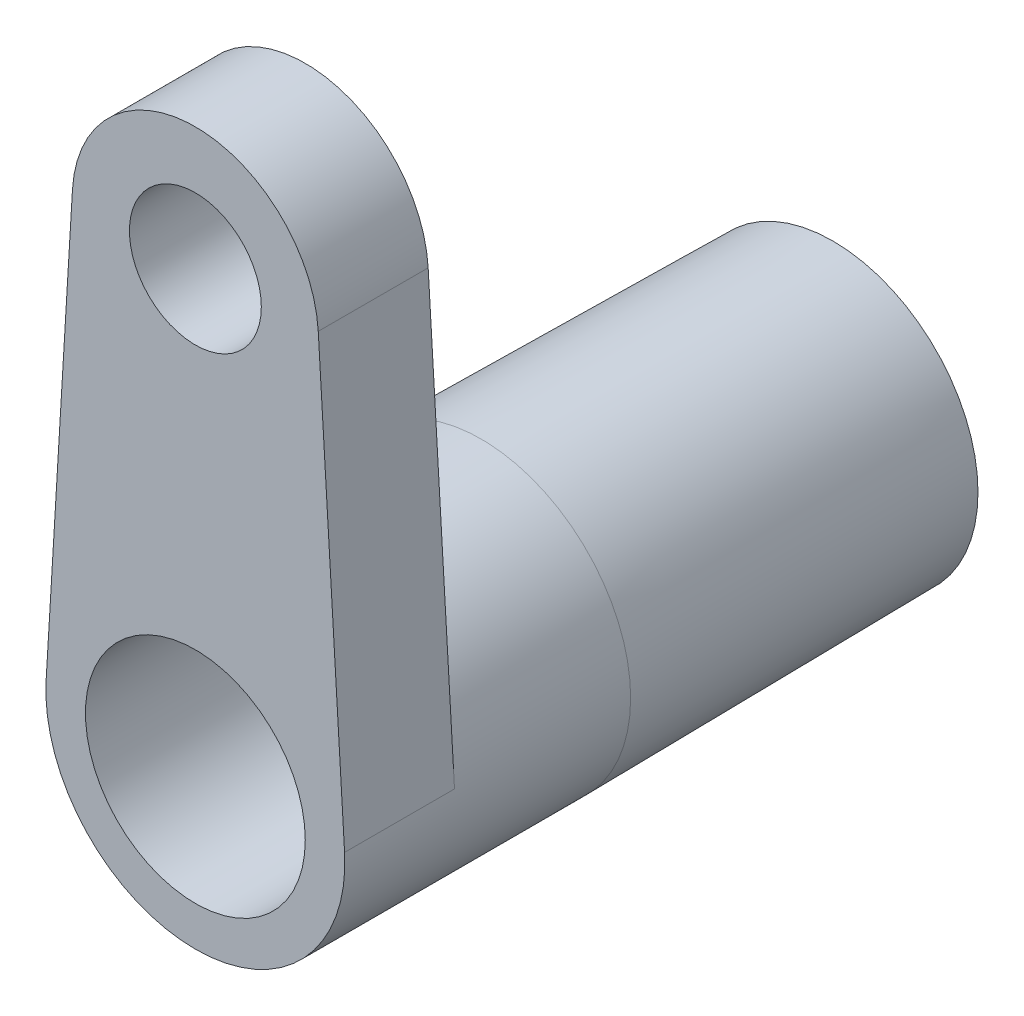
ISO-10303-21;
HEADER;
FILE_DESCRIPTION(('STEP AP214'),'2;1');
FILE_NAME('part.step','',(''),(''),'','','');
FILE_SCHEMA(('AUTOMOTIVE_DESIGN { 1 0 10303 214 1 1 1 1 }'));
ENDSEC;
DATA;
#1=APPLICATION_CONTEXT('core data for automotive mechanical design processes');
#2=APPLICATION_PROTOCOL_DEFINITION('international standard','automotive_design',2000,#1);
#3=PRODUCT_CONTEXT('',#1,'mechanical');
#4=PRODUCT('Part','Part','',(#3));
#5=PRODUCT_RELATED_PRODUCT_CATEGORY('part','',(#4));
#6=PRODUCT_DEFINITION_FORMATION('','',#4);
#7=PRODUCT_DEFINITION_CONTEXT('part definition',#1,'design');
#8=PRODUCT_DEFINITION('design','',#6,#7);
#9=PRODUCT_DEFINITION_SHAPE('','',#8);
#10=(LENGTH_UNIT() NAMED_UNIT(*) SI_UNIT(.MILLI.,.METRE.));
#11=(NAMED_UNIT(*) PLANE_ANGLE_UNIT() SI_UNIT($,.RADIAN.));
#12=(NAMED_UNIT(*) SI_UNIT($,.STERADIAN.) SOLID_ANGLE_UNIT());
#13=UNCERTAINTY_MEASURE_WITH_UNIT(LENGTH_MEASURE(1.E-05),#10,'distance_accuracy_value','');
#14=(GEOMETRIC_REPRESENTATION_CONTEXT(3) GLOBAL_UNCERTAINTY_ASSIGNED_CONTEXT((#13)) GLOBAL_UNIT_ASSIGNED_CONTEXT((#10,
#11,#12)) REPRESENTATION_CONTEXT('',''));
#15=CARTESIAN_POINT('',(0.,0.,0.));
#16=DIRECTION('',(0.,0.,1.));
#17=DIRECTION('',(1.,0.,0.));
#18=AXIS2_PLACEMENT_3D('',#15,#16,#17);
#19=CARTESIAN_POINT('',(0.,0.,12.));
#20=DIRECTION('',(0.,0.,-1.));
#21=DIRECTION('',(-1.,0.,0.));
#22=AXIS2_PLACEMENT_3D('',#19,#20,#21);
#23=CYLINDRICAL_SURFACE('',#22,1.5);
#24=CARTESIAN_POINT('',(0.,0.,3.5));
#25=DIRECTION('',(0.,0.,1.));
#26=DIRECTION('',(1.,0.,0.));
#27=AXIS2_PLACEMENT_3D('',#24,#25,#26);
#28=CIRCLE('',#27,1.5);
#29=CARTESIAN_POINT('',(1.5,0.,3.5));
#30=VERTEX_POINT('',#29);
#31=EDGE_CURVE('E119',#30,#30,#28,.T.);
#32=ORIENTED_EDGE('',*,*,#31,.F.);
#33=EDGE_LOOP('',(#32));
#34=FACE_BOUND('',#33,.T.);
#35=CARTESIAN_POINT('',(0.,0.,5.5));
#36=DIRECTION('',(0.,0.,1.));
#37=DIRECTION('',(1.,0.,0.));
#38=AXIS2_PLACEMENT_3D('',#35,#36,#37);
#39=CIRCLE('',#38,1.5);
#40=CARTESIAN_POINT('',(1.5,0.,5.5));
#41=VERTEX_POINT('',#40);
#42=EDGE_CURVE('E113',#41,#41,#39,.T.);
#43=ORIENTED_EDGE('',*,*,#42,.T.);
#44=EDGE_LOOP('',(#43));
#45=FACE_BOUND('',#44,.T.);
#46=ADVANCED_FACE('F34',(#34,#45),#23,.F.);
#47=CARTESIAN_POINT('',(0.,0.,0.));
#48=DIRECTION('',(0.,0.,1.));
#49=DIRECTION('',(1.,0.,0.));
#50=AXIS2_PLACEMENT_3D('',#47,#48,#49);
#51=PLANE('',#50);
#52=CARTESIAN_POINT('',(0.,0.,0.));
#53=DIRECTION('',(0.,0.,1.));
#54=DIRECTION('',(1.,0.,0.));
#55=AXIS2_PLACEMENT_3D('',#52,#53,#54);
#56=CIRCLE('',#55,3.30000000000013);
#57=CARTESIAN_POINT('',(3.30000000000013,0.,0.));
#58=VERTEX_POINT('',#57);
#59=EDGE_CURVE('E11',#58,#58,#56,.F.);
#60=ORIENTED_EDGE('',*,*,#59,.T.);
#61=EDGE_LOOP('',(#60));
#62=FACE_BOUND('',#61,.T.);
#63=CARTESIAN_POINT('',(0.,0.,0.));
#64=DIRECTION('',(0.,0.,1.));
#65=DIRECTION('',(1.,0.,0.));
#66=AXIS2_PLACEMENT_3D('',#63,#64,#65);
#67=CIRCLE('',#66,2.4);
#68=CARTESIAN_POINT('',(2.4,0.,0.));
#69=VERTEX_POINT('',#68);
#70=EDGE_CURVE('E126',#69,#69,#67,.T.);
#71=ORIENTED_EDGE('',*,*,#70,.T.);
#72=EDGE_LOOP('',(#71));
#73=FACE_BOUND('',#72,.T.);
#74=ADVANCED_FACE('F143',(#62,#73),#51,.F.);
#75=CARTESIAN_POINT('',(0.,0.,3.5));
#76=DIRECTION('',(0.,0.,-1.));
#77=DIRECTION('',(-1.,0.,0.));
#78=AXIS2_PLACEMENT_3D('',#75,#76,#77);
#79=CYLINDRICAL_SURFACE('',#78,3.4);
#80=CARTESIAN_POINT('',(0.,0.,7.99999999999146));
#81=DIRECTION('',(0.,0.,1.));
#82=DIRECTION('',(1.,0.,0.));
#83=AXIS2_PLACEMENT_3D('',#80,#81,#82);
#84=CIRCLE('',#83,3.4);
#85=CARTESIAN_POINT('',(3.4,0.,7.99999999999146));
#86=VERTEX_POINT('',#85);
#87=EDGE_CURVE('E42',#86,#86,#84,.T.);
#88=ORIENTED_EDGE('',*,*,#87,.T.);
#89=EDGE_LOOP('',(#88));
#90=FACE_BOUND('',#89,.T.);
#91=CARTESIAN_POINT('',(0.,0.,12.));
#92=DIRECTION('',(0.,0.,1.));
#93=DIRECTION('',(1.,0.,0.));
#94=AXIS2_PLACEMENT_3D('',#91,#92,#93);
#95=CIRCLE('',#94,3.4);
#96=CARTESIAN_POINT('',(3.39387448206324,0.203999999999999,12.));
#97=VERTEX_POINT('',#96);
#98=CARTESIAN_POINT('',(-3.39387448206323,0.204,12.));
#99=VERTEX_POINT('',#98);
#100=EDGE_CURVE('E49',#97,#99,#95,.T.);
#101=ORIENTED_EDGE('',*,*,#100,.F.);
#102=DIRECTION('',(0.,0.,-1.));
#103=VECTOR('',#102,1.);
#104=CARTESIAN_POINT('',(3.39387448206324,0.203999999999999,14.5));
#105=LINE('',#104,#103);
#106=CARTESIAN_POINT('',(3.39387448206324,0.203999999999999,14.5));
#107=VERTEX_POINT('',#106);
#108=EDGE_CURVE('E96',#107,#97,#105,.T.);
#109=ORIENTED_EDGE('',*,*,#108,.F.);
#110=CARTESIAN_POINT('',(0.,0.,14.5));
#111=DIRECTION('',(0.,0.,1.));
#112=DIRECTION('',(1.,0.,0.));
#113=AXIS2_PLACEMENT_3D('',#110,#111,#112);
#114=CIRCLE('',#113,3.4);
#115=CARTESIAN_POINT('',(-3.39387448206324,0.204,14.5));
#116=VERTEX_POINT('',#115);
#117=EDGE_CURVE('E84',#116,#107,#114,.T.);
#118=ORIENTED_EDGE('',*,*,#117,.F.);
#119=DIRECTION('',(0.,0.,-1.));
#120=VECTOR('',#119,1.);
#121=CARTESIAN_POINT('',(-3.39387448206324,0.204,14.5));
#122=LINE('',#121,#120);
#123=EDGE_CURVE('E91',#116,#99,#122,.T.);
#124=ORIENTED_EDGE('',*,*,#123,.T.);
#125=EDGE_LOOP('',(#101,#109,#118,#124));
#126=FACE_BOUND('',#125,.T.);
#127=ADVANCED_FACE('F98',(#90,#126),#79,.T.);
#128=CARTESIAN_POINT('',(0.,0.,3.5));
#129=DIRECTION('',(0.,0.,-1.));
#130=DIRECTION('',(-1.,0.,0.));
#131=AXIS2_PLACEMENT_3D('',#128,#129,#130);
#132=CYLINDRICAL_SURFACE('',#131,2.4);
#133=CARTESIAN_POINT('',(0.,0.,3.5));
#134=DIRECTION('',(0.,0.,1.));
#135=DIRECTION('',(1.,0.,0.));
#136=AXIS2_PLACEMENT_3D('',#133,#134,#135);
#137=CIRCLE('',#136,2.4);
#138=CARTESIAN_POINT('',(2.4,0.,3.5));
#139=VERTEX_POINT('',#138);
#140=EDGE_CURVE('E123',#139,#139,#137,.T.);
#141=ORIENTED_EDGE('',*,*,#140,.T.);
#142=EDGE_LOOP('',(#141));
#143=FACE_BOUND('',#142,.T.);
#144=ORIENTED_EDGE('',*,*,#70,.F.);
#145=EDGE_LOOP('',(#144));
#146=FACE_BOUND('',#145,.T.);
#147=ADVANCED_FACE('F160',(#143,#146),#132,.F.);
#148=CARTESIAN_POINT('',(0.,0.,3.5));
#149=DIRECTION('',(0.,0.,1.));
#150=DIRECTION('',(1.,0.,0.));
#151=AXIS2_PLACEMENT_3D('',#148,#149,#150);
#152=PLANE('',#151);
#153=ORIENTED_EDGE('',*,*,#31,.T.);
#154=EDGE_LOOP('',(#153));
#155=FACE_BOUND('',#154,.T.);
#156=ORIENTED_EDGE('',*,*,#140,.F.);
#157=EDGE_LOOP('',(#156));
#158=FACE_BOUND('',#157,.T.);
#159=ADVANCED_FACE('F157',(#155,#158),#152,.F.);
#160=CARTESIAN_POINT('',(0.,0.,5.5));
#161=DIRECTION('',(0.,0.,1.));
#162=DIRECTION('',(1.,0.,0.));
#163=AXIS2_PLACEMENT_3D('',#160,#161,#162);
#164=CYLINDRICAL_SURFACE('',#163,2.5);
#165=CARTESIAN_POINT('',(0.,0.,5.5));
#166=DIRECTION('',(0.,0.,1.));
#167=DIRECTION('',(1.,0.,0.));
#168=AXIS2_PLACEMENT_3D('',#165,#166,#167);
#169=CIRCLE('',#168,2.5);
#170=CARTESIAN_POINT('',(2.5,0.,5.5));
#171=VERTEX_POINT('',#170);
#172=EDGE_CURVE('E116',#171,#171,#169,.T.);
#173=CARTESIAN_POINT('',(0.,0.,14.5));
#174=DIRECTION('',(0.,0.,1.));
#175=DIRECTION('',(1.,0.,0.));
#176=AXIS2_PLACEMENT_3D('',#173,#174,#175);
#177=CIRCLE('',#176,2.5);
#178=CARTESIAN_POINT('',(2.5,0.,14.5));
#179=VERTEX_POINT('',#178);
#180=EDGE_CURVE('E278',#179,#179,#177,.T.);
#181=CARTESIAN_POINT('',(2.5,0.,5.5));
#182=CARTESIAN_POINT('',(2.5,0.,5.59375));
#183=CARTESIAN_POINT('',(2.5,0.,5.6875));
#184=CARTESIAN_POINT('',(2.5,0.,5.875));
#185=CARTESIAN_POINT('',(2.5,0.,5.96875));
#186=CARTESIAN_POINT('',(2.5,0.,6.15625));
#187=CARTESIAN_POINT('',(2.5,0.,6.25));
#188=CARTESIAN_POINT('',(2.5,0.,6.4375));
#189=CARTESIAN_POINT('',(2.5,0.,6.53125));
#190=CARTESIAN_POINT('',(2.5,0.,6.71875));
#191=CARTESIAN_POINT('',(2.5,0.,6.8125));
#192=CARTESIAN_POINT('',(2.5,0.,7.));
#193=CARTESIAN_POINT('',(2.5,0.,7.09375));
#194=CARTESIAN_POINT('',(2.5,0.,7.28125));
#195=CARTESIAN_POINT('',(2.5,0.,7.375));
#196=CARTESIAN_POINT('',(2.5,0.,7.5625));
#197=CARTESIAN_POINT('',(2.5,0.,7.65625));
#198=CARTESIAN_POINT('',(2.5,0.,7.84375));
#199=CARTESIAN_POINT('',(2.5,0.,7.9375));
#200=CARTESIAN_POINT('',(2.5,0.,8.125));
#201=CARTESIAN_POINT('',(2.5,0.,8.21875));
#202=CARTESIAN_POINT('',(2.5,0.,8.40625));
#203=CARTESIAN_POINT('',(2.5,0.,8.5));
#204=CARTESIAN_POINT('',(2.5,0.,8.6875));
#205=CARTESIAN_POINT('',(2.5,0.,8.78125));
#206=CARTESIAN_POINT('',(2.5,0.,8.96875));
#207=CARTESIAN_POINT('',(2.5,0.,9.0625));
#208=CARTESIAN_POINT('',(2.5,0.,9.25));
#209=CARTESIAN_POINT('',(2.5,0.,9.34375));
#210=CARTESIAN_POINT('',(2.5,0.,9.53125));
#211=CARTESIAN_POINT('',(2.5,0.,9.625));
#212=CARTESIAN_POINT('',(2.5,0.,9.8125));
#213=CARTESIAN_POINT('',(2.5,0.,9.90625));
#214=CARTESIAN_POINT('',(2.5,0.,10.09375));
#215=CARTESIAN_POINT('',(2.5,0.,10.1875));
#216=CARTESIAN_POINT('',(2.5,0.,10.375));
#217=CARTESIAN_POINT('',(2.5,0.,10.46875));
#218=CARTESIAN_POINT('',(2.5,0.,10.65625));
#219=CARTESIAN_POINT('',(2.5,0.,10.75));
#220=CARTESIAN_POINT('',(2.5,0.,10.9375));
#221=CARTESIAN_POINT('',(2.5,0.,11.03125));
#222=CARTESIAN_POINT('',(2.5,0.,11.21875));
#223=CARTESIAN_POINT('',(2.5,0.,11.3125));
#224=CARTESIAN_POINT('',(2.5,0.,11.5));
#225=CARTESIAN_POINT('',(2.5,0.,11.59375));
#226=CARTESIAN_POINT('',(2.5,0.,11.78125));
#227=CARTESIAN_POINT('',(2.5,0.,11.875));
#228=CARTESIAN_POINT('',(2.5,0.,12.0625));
#229=CARTESIAN_POINT('',(2.5,0.,12.15625));
#230=CARTESIAN_POINT('',(2.5,0.,12.34375));
#231=CARTESIAN_POINT('',(2.5,0.,12.4375));
#232=CARTESIAN_POINT('',(2.5,0.,12.625));
#233=CARTESIAN_POINT('',(2.5,0.,12.71875));
#234=CARTESIAN_POINT('',(2.5,0.,12.90625));
#235=CARTESIAN_POINT('',(2.5,0.,13.));
#236=CARTESIAN_POINT('',(2.5,0.,13.1875));
#237=CARTESIAN_POINT('',(2.5,0.,13.28125));
#238=CARTESIAN_POINT('',(2.5,0.,13.46875));
#239=CARTESIAN_POINT('',(2.5,0.,13.5625));
#240=CARTESIAN_POINT('',(2.5,0.,13.75));
#241=CARTESIAN_POINT('',(2.5,0.,13.84375));
#242=CARTESIAN_POINT('',(2.5,0.,14.03125));
#243=CARTESIAN_POINT('',(2.5,0.,14.125));
#244=CARTESIAN_POINT('',(2.5,0.,14.3125));
#245=CARTESIAN_POINT('',(2.5,0.,14.40625));
#246=CARTESIAN_POINT('',(2.5,0.,14.5));
#247=B_SPLINE_CURVE_WITH_KNOTS('',3,(#181,#182,#183,#184,#185,#186,#187,#188,#189,#190,#191,
#192,#193,#194,#195,#196,#197,#198,#199,#200,#201,#202,#203,#204,#205,#206,#207,#208,#209,#210,
#211,#212,#213,#214,#215,#216,#217,#218,#219,#220,#221,#222,#223,#224,#225,#226,#227,#228,#229,
#230,#231,#232,#233,#234,#235,#236,#237,#238,#239,#240,#241,#242,#243,#244,#245,#246),
.UNSPECIFIED.,.F.,.F.,(4,2,2,2,2,2,2,2,2,2,2,2,2,2,2,2,2,2,2,2,2,2,2,2,2,2,2,2,2,2,2,2,4),(0.,
0.281249999999999,0.5625,0.84375,1.125,1.40625,1.6875,1.96875,2.25,2.53125,2.8125,3.09375,3.375,
3.65625,3.9375,4.21875,4.5,4.78125,5.0625,5.34375,5.625,5.90625,6.1875,6.46875,6.75,7.03125,
7.3125,7.59375,7.875,8.15625,8.4375,8.71875,9.),.UNSPECIFIED.);
#248=EDGE_CURVE('BSEAM155',#171,#179,#247,.T.);
#249=ORIENTED_EDGE('',*,*,#172,.F.);
#250=ORIENTED_EDGE('',*,*,#180,.T.);
#251=ORIENTED_EDGE('',*,*,#248,.T.);
#252=ORIENTED_EDGE('',*,*,#248,.F.);
#253=EDGE_LOOP('',(#249,#251,#250,#252));
#254=FACE_BOUND('',#253,.T.);
#255=ADVANCED_FACE('F155',(#254),#164,.F.);
#256=CARTESIAN_POINT('',(0.,0.,5.5));
#257=DIRECTION('',(0.,0.,1.));
#258=DIRECTION('',(1.,0.,0.));
#259=AXIS2_PLACEMENT_3D('',#256,#257,#258);
#260=PLANE('',#259);
#261=ORIENTED_EDGE('',*,*,#42,.F.);
#262=EDGE_LOOP('',(#261));
#263=FACE_BOUND('',#262,.T.);
#264=ORIENTED_EDGE('',*,*,#172,.T.);
#265=EDGE_LOOP('',(#264));
#266=FACE_BOUND('',#265,.T.);
#267=ADVANCED_FACE('F183',(#263,#266),#260,.T.);
#268=CARTESIAN_POINT('',(0.,10.,14.5));
#269=DIRECTION('',(0.,0.,-1.));
#270=DIRECTION('',(-1.,0.,0.));
#271=AXIS2_PLACEMENT_3D('',#268,#269,#270);
#272=PLANE('',#271);
#273=CARTESIAN_POINT('',(0.,10.,14.5));
#274=DIRECTION('',(0.,0.,1.));
#275=DIRECTION('',(-1.,0.,0.));
#276=AXIS2_PLACEMENT_3D('',#273,#274,#275);
#277=CIRCLE('',#276,2.8);
#278=CARTESIAN_POINT('',(2.79495545581678,10.168,14.5));
#279=VERTEX_POINT('',#278);
#280=CARTESIAN_POINT('',(-2.79495545581678,10.168,14.5));
#281=VERTEX_POINT('',#280);
#282=EDGE_CURVE('E87',#279,#281,#277,.T.);
#283=ORIENTED_EDGE('',*,*,#282,.T.);
#284=DIRECTION('',(-0.0599999999999999,-0.998198377077422,0.));
#285=VECTOR('',#284,1.);
#286=CARTESIAN_POINT('',(-2.79495545581678,10.168,14.5));
#287=LINE('',#286,#285);
#288=EDGE_CURVE('E80',#281,#116,#287,.T.);
#289=ORIENTED_EDGE('',*,*,#288,.T.);
#290=ORIENTED_EDGE('',*,*,#117,.T.);
#291=DIRECTION('',(-0.0599999999999999,0.998198377077422,0.));
#292=VECTOR('',#291,1.);
#293=CARTESIAN_POINT('',(2.79495545581678,10.168,14.5));
#294=LINE('',#293,#292);
#295=EDGE_CURVE('E58',#107,#279,#294,.T.);
#296=ORIENTED_EDGE('',*,*,#295,.T.);
#297=EDGE_LOOP('',(#283,#289,#290,#296));
#298=FACE_BOUND('',#297,.T.);
#299=CARTESIAN_POINT('',(0.,10.,14.5));
#300=DIRECTION('',(0.,0.,1.));
#301=DIRECTION('',(1.,0.,0.));
#302=AXIS2_PLACEMENT_3D('',#299,#300,#301);
#303=CIRCLE('',#302,1.5);
#304=CARTESIAN_POINT('',(1.5,10.,14.5));
#305=VERTEX_POINT('',#304);
#306=EDGE_CURVE('E107',#305,#305,#303,.T.);
#307=ORIENTED_EDGE('',*,*,#306,.F.);
#308=EDGE_LOOP('',(#307));
#309=FACE_BOUND('',#308,.T.);
#310=ORIENTED_EDGE('',*,*,#180,.F.);
#311=EDGE_LOOP('',(#310));
#312=FACE_BOUND('',#311,.T.);
#313=ADVANCED_FACE('F81',(#298,#309,#312),#272,.F.);
#314=CARTESIAN_POINT('',(0.,10.,12.));
#315=DIRECTION('',(0.,0.,-1.));
#316=DIRECTION('',(-1.,0.,0.));
#317=AXIS2_PLACEMENT_3D('',#314,#315,#316);
#318=PLANE('',#317);
#319=CARTESIAN_POINT('',(0.,10.,12.));
#320=DIRECTION('',(0.,0.,1.));
#321=DIRECTION('',(1.,0.,0.));
#322=AXIS2_PLACEMENT_3D('',#319,#320,#321);
#323=CIRCLE('',#322,1.5);
#324=CARTESIAN_POINT('',(1.5,10.,12.));
#325=VERTEX_POINT('',#324);
#326=EDGE_CURVE('E275',#325,#325,#323,.T.);
#327=ORIENTED_EDGE('',*,*,#326,.T.);
#328=EDGE_LOOP('',(#327));
#329=FACE_BOUND('',#328,.T.);
#330=DIRECTION('',(-0.0599999999999999,0.998198377077422,0.));
#331=VECTOR('',#330,1.);
#332=CARTESIAN_POINT('',(2.79495545581678,10.168,12.));
#333=LINE('',#332,#331);
#334=CARTESIAN_POINT('',(2.79495545581678,10.168,12.));
#335=VERTEX_POINT('',#334);
#336=EDGE_CURVE('E72',#97,#335,#333,.T.);
#337=ORIENTED_EDGE('',*,*,#336,.F.);
#338=ORIENTED_EDGE('',*,*,#100,.T.);
#339=DIRECTION('',(-0.0599999999999999,-0.998198377077422,0.));
#340=VECTOR('',#339,1.);
#341=CARTESIAN_POINT('',(-2.79495545581678,10.168,12.));
#342=LINE('',#341,#340);
#343=CARTESIAN_POINT('',(-2.79495545581678,10.168,12.));
#344=VERTEX_POINT('',#343);
#345=EDGE_CURVE('E93',#344,#99,#342,.T.);
#346=ORIENTED_EDGE('',*,*,#345,.F.);
#347=CARTESIAN_POINT('',(0.,10.,12.));
#348=DIRECTION('',(0.,0.,1.));
#349=DIRECTION('',(-1.,0.,0.));
#350=AXIS2_PLACEMENT_3D('',#347,#348,#349);
#351=CIRCLE('',#350,2.8);
#352=EDGE_CURVE('E104',#335,#344,#351,.T.);
#353=ORIENTED_EDGE('',*,*,#352,.F.);
#354=EDGE_LOOP('',(#337,#338,#346,#353));
#355=FACE_BOUND('',#354,.T.);
#356=ADVANCED_FACE('F196',(#329,#355),#318,.T.);
#357=CARTESIAN_POINT('',(0.,10.,14.5));
#358=DIRECTION('',(0.,0.,-1.));
#359=DIRECTION('',(-1.,0.,0.));
#360=AXIS2_PLACEMENT_3D('',#357,#358,#359);
#361=CYLINDRICAL_SURFACE('',#360,2.8);
#362=ORIENTED_EDGE('',*,*,#352,.T.);
#363=DIRECTION('',(0.,0.,-1.));
#364=VECTOR('',#363,1.);
#365=CARTESIAN_POINT('',(-2.79495545581678,10.168,14.5));
#366=LINE('',#365,#364);
#367=EDGE_CURVE('E95',#281,#344,#366,.T.);
#368=ORIENTED_EDGE('',*,*,#367,.F.);
#369=ORIENTED_EDGE('',*,*,#282,.F.);
#370=DIRECTION('',(0.,0.,-1.));
#371=VECTOR('',#370,1.);
#372=CARTESIAN_POINT('',(2.79495545581678,10.168,14.5));
#373=LINE('',#372,#371);
#374=EDGE_CURVE('E100',#279,#335,#373,.T.);
#375=ORIENTED_EDGE('',*,*,#374,.T.);
#376=EDGE_LOOP('',(#362,#368,#369,#375));
#377=FACE_BOUND('',#376,.T.);
#378=ADVANCED_FACE('F203',(#377),#361,.T.);
#379=CARTESIAN_POINT('',(-2.79495545581678,10.168,14.5));
#380=DIRECTION('',(0.998198377077422,-0.0599999999999999,0.));
#381=DIRECTION('',(0.0599999999999999,0.998198377077422,0.));
#382=AXIS2_PLACEMENT_3D('',#379,#380,#381);
#383=PLANE('',#382);
#384=ORIENTED_EDGE('',*,*,#345,.T.);
#385=ORIENTED_EDGE('',*,*,#123,.F.);
#386=ORIENTED_EDGE('',*,*,#288,.F.);
#387=ORIENTED_EDGE('',*,*,#367,.T.);
#388=EDGE_LOOP('',(#384,#385,#386,#387));
#389=FACE_BOUND('',#388,.T.);
#390=ADVANCED_FACE('F92',(#389),#383,.F.);
#391=CARTESIAN_POINT('',(2.79495545581678,10.168,14.5));
#392=DIRECTION('',(-0.998198377077422,-0.0599999999999999,0.));
#393=DIRECTION('',(0.0599999999999999,-0.998198377077422,0.));
#394=AXIS2_PLACEMENT_3D('',#391,#392,#393);
#395=PLANE('',#394);
#396=ORIENTED_EDGE('',*,*,#336,.T.);
#397=ORIENTED_EDGE('',*,*,#374,.F.);
#398=ORIENTED_EDGE('',*,*,#295,.F.);
#399=ORIENTED_EDGE('',*,*,#108,.T.);
#400=EDGE_LOOP('',(#396,#397,#398,#399));
#401=FACE_BOUND('',#400,.T.);
#402=ADVANCED_FACE('F138',(#401),#395,.F.);
#403=CARTESIAN_POINT('',(0.,10.,14.5));
#404=DIRECTION('',(0.,0.,-1.));
#405=DIRECTION('',(-1.,0.,0.));
#406=AXIS2_PLACEMENT_3D('',#403,#404,#405);
#407=CYLINDRICAL_SURFACE('',#406,1.5);
#408=ORIENTED_EDGE('',*,*,#306,.T.);
#409=EDGE_LOOP('',(#408));
#410=FACE_BOUND('',#409,.T.);
#411=ORIENTED_EDGE('',*,*,#326,.F.);
#412=EDGE_LOOP('',(#411));
#413=FACE_BOUND('',#412,.T.);
#414=ADVANCED_FACE('F133',(#410,#413),#407,.F.);
#415=CARTESIAN_POINT('',(0.,0.,7.99999999999146));
#416=DIRECTION('',(0.,0.,1.));
#417=DIRECTION('',(1.,0.,0.));
#418=AXIS2_PLACEMENT_3D('',#415,#416,#417);
#419=CONICAL_SURFACE('',#418,3.4,0.0124993490193581);
#420=ORIENTED_EDGE('',*,*,#59,.F.);
#421=EDGE_LOOP('',(#420));
#422=FACE_BOUND('',#421,.T.);
#423=ORIENTED_EDGE('',*,*,#87,.F.);
#424=EDGE_LOOP('',(#423));
#425=FACE_BOUND('',#424,.T.);
#426=ADVANCED_FACE('F36',(#422,#425),#419,.T.);
#427=CLOSED_SHELL('',(#46,#74,#127,#147,#159,#255,#267,#313,#356,#378,#390,#402,#414,#426));
#428=MANIFOLD_SOLID_BREP('B2',#427);
#429=ADVANCED_BREP_SHAPE_REPRESENTATION('',(#18,#428),#14);
#430=SHAPE_DEFINITION_REPRESENTATION(#9,#429);
ENDSEC;
END-ISO-10303-21;
